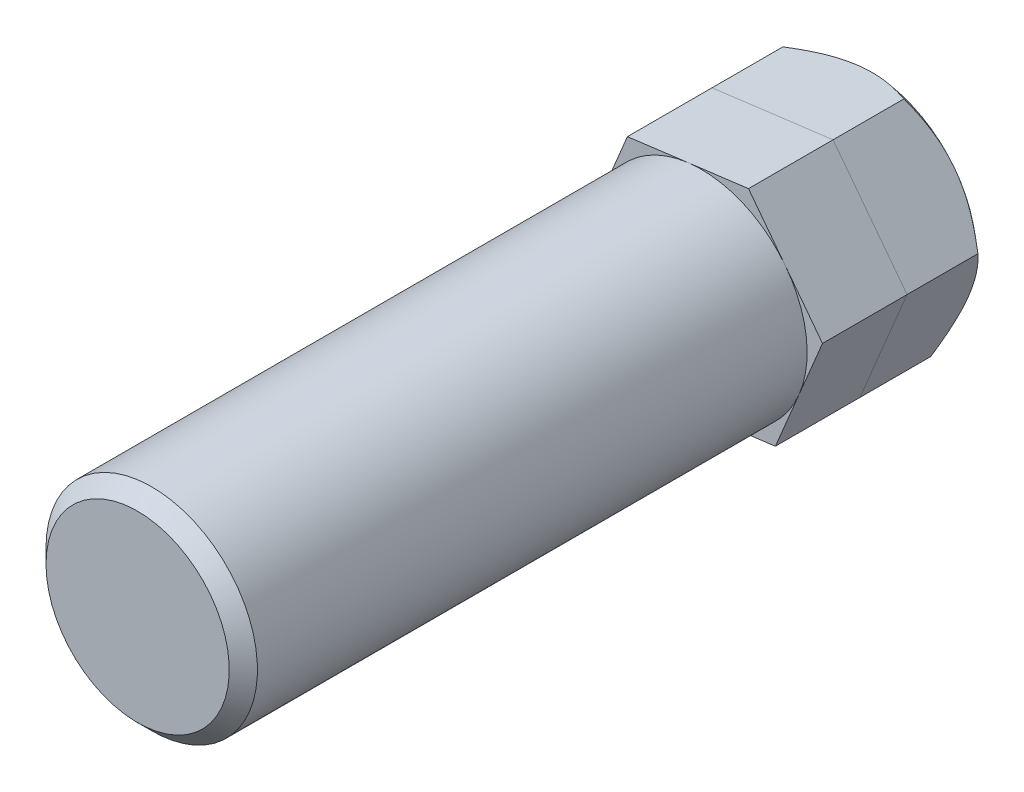
ISO-10303-21;
HEADER;
FILE_DESCRIPTION(('STEP AP214'),'2;1');
FILE_NAME('part.step','',(''),(''),'','','');
FILE_SCHEMA(('AUTOMOTIVE_DESIGN { 1 0 10303 214 1 1 1 1 }'));
ENDSEC;
DATA;
#1=APPLICATION_CONTEXT('core data for automotive mechanical design processes');
#2=APPLICATION_PROTOCOL_DEFINITION('international standard','automotive_design',2000,#1);
#3=PRODUCT_CONTEXT('',#1,'mechanical');
#4=PRODUCT('Part','Part','',(#3));
#5=PRODUCT_RELATED_PRODUCT_CATEGORY('part','',(#4));
#6=PRODUCT_DEFINITION_FORMATION('','',#4);
#7=PRODUCT_DEFINITION_CONTEXT('part definition',#1,'design');
#8=PRODUCT_DEFINITION('design','',#6,#7);
#9=PRODUCT_DEFINITION_SHAPE('','',#8);
#10=(LENGTH_UNIT() NAMED_UNIT(*) SI_UNIT(.MILLI.,.METRE.));
#11=(NAMED_UNIT(*) PLANE_ANGLE_UNIT() SI_UNIT($,.RADIAN.));
#12=(NAMED_UNIT(*) SI_UNIT($,.STERADIAN.) SOLID_ANGLE_UNIT());
#13=UNCERTAINTY_MEASURE_WITH_UNIT(LENGTH_MEASURE(1.E-05),#10,'distance_accuracy_value','');
#14=(GEOMETRIC_REPRESENTATION_CONTEXT(3) GLOBAL_UNCERTAINTY_ASSIGNED_CONTEXT((#13)) GLOBAL_UNIT_ASSIGNED_CONTEXT((#10,
#11,#12)) REPRESENTATION_CONTEXT('',''));
#15=CARTESIAN_POINT('',(0.,0.,0.));
#16=DIRECTION('',(0.,0.,1.));
#17=DIRECTION('',(1.,0.,0.));
#18=AXIS2_PLACEMENT_3D('',#15,#16,#17);
#19=CARTESIAN_POINT('',(-8.58993862808278,-1.10134207482113,-52.));
#20=DIRECTION('',(0.922579877145062,-0.385806130442483,0.));
#21=DIRECTION('',(0.385806130442483,0.922579877145062,0.));
#22=AXIS2_PLACEMENT_3D('',#19,#20,#21);
#23=PLANE('',#22);
#24=CARTESIAN_POINT('',(-8.59002226444641,-1.10154207482113,-51.026340311631));
#25=CARTESIAN_POINT('',(-8.53377014086731,-0.96702612713198,-51.0875085611409));
#26=CARTESIAN_POINT('',(-8.47720055395256,-0.831751027988002,-51.1467175475263));
#27=CARTESIAN_POINT('',(-8.36338103235081,-0.559573911114254,-51.2607068762048));
#28=CARTESIAN_POINT('',(-8.30613088252565,-0.422671378923652,-51.3154857729325));
#29=CARTESIAN_POINT('',(-8.13300505145684,-0.0086748263678155,-51.4726637107743));
#30=CARTESIAN_POINT('',(-8.01608732404049,0.270911043540857,-51.567534799761));
#31=CARTESIAN_POINT('',(-7.78067792578121,0.833846561117379,-51.7315243665977));
#32=CARTESIAN_POINT('',(-7.66221048288123,1.11713827239994,-51.8008707818279));
#33=CARTESIAN_POINT('',(-7.48309333825638,1.54546187911155,-51.8829320941813));
#34=CARTESIAN_POINT('',(-7.42317735813299,1.68873922288486,-51.9066207440832));
#35=CARTESIAN_POINT('',(-7.30296791062,1.97619659737243,-51.9462469670778));
#36=CARTESIAN_POINT('',(-7.24267449610398,2.12037650164989,-51.9621856022774));
#37=CARTESIAN_POINT('',(-7.12080352391906,2.41180708730948,-51.986170790856));
#38=CARTESIAN_POINT('',(-7.05922180337203,2.5590677234002,-51.9940759611731));
#39=CARTESIAN_POINT('',(-6.93598509514346,2.85376419959895,-52.0013219835031));
#40=CARTESIAN_POINT('',(-6.87433010999763,3.00120003364332,-52.0006631237565));
#41=CARTESIAN_POINT('',(-6.75109890372541,3.29588335298993,-51.9907928475705));
#42=CARTESIAN_POINT('',(-6.68952272040543,3.44313074788555,-51.9815782514472));
#43=CARTESIAN_POINT('',(-6.56663763165669,3.7369863948934,-51.9548145508762));
#44=CARTESIAN_POINT('',(-6.505328764839,3.88359455467484,-51.9372642802097));
#45=CARTESIAN_POINT('',(-6.32206142727575,4.32184253580433,-51.8726612748921));
#46=CARTESIAN_POINT('',(-6.20071164984,4.61202678619417,-51.8136517865799));
#47=CARTESIAN_POINT('',(-5.96049284294287,5.18646306355687,-51.6682312829833));
#48=CARTESIAN_POINT('',(-5.84162489269428,5.4707125098035,-51.5818086012074));
#49=CARTESIAN_POINT('',(-5.68382153494708,5.84806836528592,-51.450782664686));
#50=CARTESIAN_POINT('',(-5.64363535745074,5.94416574625544,-51.4159666076294));
#51=CARTESIAN_POINT('',(-5.56360392040255,6.13554526963154,-51.3439167923615));
#52=CARTESIAN_POINT('',(-5.52375852232242,6.23082774330141,-51.3066840751193));
#53=CARTESIAN_POINT('',(-5.44453222130809,6.42028194137917,-51.230115548008));
#54=CARTESIAN_POINT('',(-5.40515017126189,6.51445640888094,-51.190787677332));
#55=CARTESIAN_POINT('',(-5.32668621137793,6.7020876172991,-51.1100670353247));
#56=CARTESIAN_POINT('',(-5.287604410883,6.79554409674349,-51.068673549395));
#57=CARTESIAN_POINT('',(-5.24867589272951,6.88863403145837,-51.026340311631));
#58=B_SPLINE_CURVE_WITH_KNOTS('',3,(#24,#25,#26,#27,#28,#29,#30,#31,#32,#33,#34,#35,#36,#37,#38,
#39,#40,#41,#42,#43,#44,#45,#46,#47,#48,#49,#50,#51,#52,#53,#54,#55,#56,#57),.UNSPECIFIED.,.F.,
.F.,(4,2,2,2,2,2,2,2,2,2,2,2,2,2,2,2,4),(0.,0.474324198766248,0.948802553120619,1.9005727913575,
2.84362466845069,3.31475083538571,3.7858124182595,4.265027816882,4.74422708654271,
5.22360451882651,5.70304903911429,6.66154650881439,7.62045244386293,7.94991498877716,
8.27923654859068,8.60738846199818,8.93565469721078),.UNSPECIFIED.);
#59=CARTESIAN_POINT('',(-8.58993862808278,-1.10134207482113,-51.0264312647728));
#60=VERTEX_POINT('',#59);
#61=CARTESIAN_POINT('',(-6.91934907858796,2.89354597831862,-52.));
#62=VERTEX_POINT('',#61);
#63=EDGE_CURVE('E206',#60,#62,#58,.T.);
#64=ORIENTED_EDGE('',*,*,#63,.F.);
#65=DIRECTION('',(0.,0.,1.));
#66=VECTOR('',#65,1.);
#67=CARTESIAN_POINT('',(-8.58993862808278,-1.10134207482113,-52.));
#68=LINE('',#67,#66);
#69=CARTESIAN_POINT('',(-8.58993862808278,-1.10134207482113,-46.));
#70=VERTEX_POINT('',#69);
#71=EDGE_CURVE('E209',#60,#70,#68,.T.);
#72=ORIENTED_EDGE('',*,*,#71,.T.);
#73=DIRECTION('',(0.385806130442483,0.922579877145062,0.));
#74=VECTOR('',#73,1.);
#75=CARTESIAN_POINT('',(-8.58993862808278,-1.10134207482113,-46.));
#76=LINE('',#75,#74);
#77=CARTESIAN_POINT('',(-5.24875952909315,6.88843403145837,-46.));
#78=VERTEX_POINT('',#77);
#79=EDGE_CURVE('E211',#70,#78,#76,.T.);
#80=ORIENTED_EDGE('',*,*,#79,.T.);
#81=DIRECTION('',(0.,0.,1.));
#82=VECTOR('',#81,1.);
#83=CARTESIAN_POINT('',(-5.24875952909315,6.88843403145837,-52.));
#84=LINE('',#83,#82);
#85=CARTESIAN_POINT('',(-5.24875952909315,6.88843403145837,-51.0264312647728));
#86=VERTEX_POINT('',#85);
#87=EDGE_CURVE('E230',#86,#78,#84,.T.);
#88=ORIENTED_EDGE('',*,*,#87,.F.);
#89=EDGE_CURVE('E120',#62,#86,#58,.T.);
#90=ORIENTED_EDGE('',*,*,#89,.F.);
#91=EDGE_LOOP('',(#64,#72,#80,#88,#90));
#92=FACE_BOUND('',#91,.T.);
#93=ADVANCED_FACE('F44',(#92),#23,.F.);
#94=CARTESIAN_POINT('',(-5.24875952909315,6.88843403145837,-52.));
#95=DIRECTION('',(0.127172028673568,-0.991880675849191,0.));
#96=DIRECTION('',(0.991880675849192,0.127172028673568,0.));
#97=AXIS2_PLACEMENT_3D('',#94,#95,#96);
#98=PLANE('',#97);
#99=CARTESIAN_POINT('',(-5.24895952909315,6.888408388852,-51.0263466664634));
#100=CARTESIAN_POINT('',(-5.10433939068617,6.9069505752622,-51.0875146915551));
#101=CARTESIAN_POINT('',(-4.95890307720289,6.92559740595344,-51.1467234508275));
#102=CARTESIAN_POINT('',(-4.66628132682386,6.96311532775169,-51.2607123205004));
#103=CARTESIAN_POINT('',(-4.51909533682376,6.9819864897739,-51.3154909853335));
#104=CARTESIAN_POINT('',(-4.07400136841499,7.03905333691703,-51.4726682185672));
#105=CARTESIAN_POINT('',(-3.77341436875176,7.07759250747537,-51.5675388290223));
#106=CARTESIAN_POINT('',(-3.16819389465971,7.15518965939001,-51.7315274439841));
#107=CARTESIAN_POINT('',(-2.86362270819353,7.19423965461777,-51.8008733855071));
#108=CARTESIAN_POINT('',(-2.40312557309435,7.25328138846221,-51.8829340091149));
#109=CARTESIAN_POINT('',(-2.24908595569838,7.27303127483193,-51.9066224331764));
#110=CARTESIAN_POINT('',(-1.94003623852985,7.31265547605923,-51.9462482165562));
#111=CARTESIAN_POINT('',(-1.78502627468961,7.3325297734885,-51.9621866379763));
#112=CARTESIAN_POINT('',(-1.47170494168344,7.3727016515332,-51.9861714108003));
#113=CARTESIAN_POINT('',(-1.31338287033203,7.39300060430826,-51.9940763806354));
#114=CARTESIAN_POINT('',(-0.996550373253947,7.4336226593439,-52.0013220272447));
#115=CARTESIAN_POINT('',(-0.838039954046063,7.45394576076868,-52.0006629922586));
#116=CARTESIAN_POINT('',(-0.521221620170635,7.49456599989716,-51.9907923949009));
#117=CARTESIAN_POINT('',(-0.362913802704524,7.51486312513838,-51.9815776528303));
#118=CARTESIAN_POINT('',(-0.0469853258814115,7.55536927299628,-51.9548136921873));
#119=CARTESIAN_POINT('',(0.110635234208787,7.57557828288568,-51.9372633074035));
#120=CARTESIAN_POINT('',(0.581801986577876,7.63598800070886,-51.872660010108));
#121=CARTESIAN_POINT('',(0.89378326704635,7.67598806655487,-51.8136503939843));
#122=CARTESIAN_POINT('',(1.51136800830125,7.75517047864893,-51.6682297566946));
#123=CARTESIAN_POINT('',(1.81696869455454,7.79435246916567,-51.5818070692668));
#124=CARTESIAN_POINT('',(2.22266791564314,7.84636839631634,-51.4507816800668));
#125=CARTESIAN_POINT('',(2.32598209586111,7.85961462059409,-51.4159661716723));
#126=CARTESIAN_POINT('',(2.53173400824279,7.8859946970873,-51.3439175319521));
#127=CARTESIAN_POINT('',(2.63417209653785,7.89912859496345,-51.3066854415513));
#128=CARTESIAN_POINT('',(2.83785412508957,7.92524328537527,-51.2301182336343));
#129=CARTESIAN_POINT('',(2.93910101436374,7.93822445601342,-51.1907910549777));
#130=CARTESIAN_POINT('',(3.14082317816846,7.96408786622404,-51.1100718579276));
#131=CARTESIAN_POINT('',(3.24129817159562,7.97697006975538,-51.0686791249582));
#132=CARTESIAN_POINT('',(3.34137909898963,7.98980174888587,-51.0263466664634));
#133=B_SPLINE_CURVE_WITH_KNOTS('',3,(#99,#100,#101,#102,#103,#104,#105,#106,#107,#108,#109,#110,
#111,#112,#113,#114,#115,#116,#117,#118,#119,#120,#121,#122,#123,#124,#125,#126,#127,#128,#129,
#130,#131,#132),.UNSPECIFIED.,.F.,.F.,(4,2,2,2,2,2,2,2,2,2,2,2,2,2,2,2,4),(0.,0.474323516251049,
0.94880118791647,1.90057004326525,2.84362056426704,3.3147460547915,3.78580696154729,
4.26502160403018,4.74422011757064,5.22359679490435,5.70304055996117,6.66153650343959,
7.62044090538751,7.94989810562754,8.27921432448177,8.60736092880068,8.93562185285166),.UNSPECIFIED.);
#134=CARTESIAN_POINT('',(-0.953790215051762,7.43910506886893,-52.));
#135=VERTEX_POINT('',#134);
#136=EDGE_CURVE('E116',#86,#135,#133,.T.);
#137=ORIENTED_EDGE('',*,*,#136,.F.);
#138=ORIENTED_EDGE('',*,*,#87,.T.);
#139=DIRECTION('',(0.991880675849192,0.127172028673568,0.));
#140=VECTOR('',#139,1.);
#141=CARTESIAN_POINT('',(-5.24875952909315,6.88843403145837,-46.));
#142=LINE('',#141,#140);
#143=CARTESIAN_POINT('',(3.34117909898963,7.9897761062795,-46.));
#144=VERTEX_POINT('',#143);
#145=EDGE_CURVE('E255',#78,#144,#142,.T.);
#146=ORIENTED_EDGE('',*,*,#145,.T.);
#147=DIRECTION('',(0.,0.,1.));
#148=VECTOR('',#147,1.);
#149=CARTESIAN_POINT('',(3.34117909898963,7.9897761062795,-52.));
#150=LINE('',#149,#148);
#151=CARTESIAN_POINT('',(3.34117909898963,7.9897761062795,-51.0264312647728));
#152=VERTEX_POINT('',#151);
#153=EDGE_CURVE('E139',#152,#144,#150,.T.);
#154=ORIENTED_EDGE('',*,*,#153,.F.);
#155=EDGE_CURVE('E124',#135,#152,#133,.T.);
#156=ORIENTED_EDGE('',*,*,#155,.F.);
#157=EDGE_LOOP('',(#137,#138,#146,#154,#156));
#158=FACE_BOUND('',#157,.T.);
#159=ADVANCED_FACE('F137',(#158),#98,.F.);
#160=CARTESIAN_POINT('',(3.34117909898963,7.9897761062795,-52.));
#161=DIRECTION('',(-0.795407848471494,-0.606074545406709,0.));
#162=DIRECTION('',(0.606074545406709,-0.795407848471494,0.));
#163=AXIS2_PLACEMENT_3D('',#160,#161,#162);
#164=PLANE('',#163);
#165=CARTESIAN_POINT('',(3.34102670558627,7.9899761062795,-51.026325769472));
#166=CARTESIAN_POINT('',(3.42939508326072,7.87400208676053,-51.0874945325293));
#167=CARTESIAN_POINT('',(3.51826217516212,7.75737355829828,-51.1467040386289));
#168=CARTESIAN_POINT('',(3.69706514251653,7.52271383757325,-51.2606944176733));
#169=CARTESIAN_POINT('',(3.78700135593785,7.4046822017633,-51.3154738450574));
#170=CARTESIAN_POINT('',(4.05897064136969,7.04775167924729,-51.4726533952903));
#171=CARTESIAN_POINT('',(4.24264070486325,6.80670441676245,-51.5675255793258));
#172=CARTESIAN_POINT('',(4.61245342099085,6.32136488369386,-51.7315173243893));
#173=CARTESIAN_POINT('',(4.79855801266919,6.07712256403299,-51.80086482363));
#174=CARTESIAN_POINT('',(5.07993935016624,5.70783973248234,-51.8829277120794));
#175=CARTESIAN_POINT('',(5.17406344828939,5.58431194708887,-51.9066168787849));
#176=CARTESIAN_POINT('',(5.36290466621658,5.33647809893837,-51.9462441077764));
#177=CARTESIAN_POINT('',(5.45762170295721,5.21217214519319,-51.9621832321804));
#178=CARTESIAN_POINT('',(5.64907312790551,4.96091268023292,-51.9861693721559));
#179=CARTESIAN_POINT('',(5.74581405610191,4.83395058598393,-51.994075001249));
#180=CARTESIAN_POINT('',(5.9394110244901,4.57987532533606,-52.0013218833652));
#181=CARTESIAN_POINT('',(6.03626706069797,4.45276216416563,-52.0006634246305));
#182=CARTESIAN_POINT('',(6.22985541114389,4.19869821364284,-51.9907938834036));
#183=CARTESIAN_POINT('',(6.32658766599604,4.0717475022281,-51.9815796212615));
#184=CARTESIAN_POINT('',(6.51963230813691,3.81839711055115,-51.9548165158318));
#185=CARTESIAN_POINT('',(6.61594463477099,3.69199750989165,-51.9372665063081));
#186=CARTESIAN_POINT('',(6.90384597113451,3.31415787900053,-51.8726641691456));
#187=CARTESIAN_POINT('',(7.09447877130594,3.0639727712747,-51.8136549733149));
#188=CARTESIAN_POINT('',(7.47184727479508,2.56871707753858,-51.6682347756615));
#189=CARTESIAN_POINT('',(7.65858128267795,2.32364871660469,-51.5818121068217));
#190=CARTESIAN_POINT('',(7.90648245793922,1.99830500774492,-51.4507849178418));
#191=CARTESIAN_POINT('',(7.96961449379408,1.91545098064625,-51.415967605254));
#192=CARTESIAN_POINT('',(8.09534296770527,1.75044584112469,-51.3439150999158));
#193=CARTESIAN_POINT('',(8.1579396234011,1.66829444307328,-51.3066809482357));
#194=CARTESIAN_POINT('',(8.28240319409231,1.5049493533861,-51.2301094023319));
#195=CARTESIAN_POINT('',(8.3442719112989,1.42375329654138,-51.190779948064));
#196=CARTESIAN_POINT('',(8.46753781165942,1.26198002073111,-51.1100559994679));
#197=CARTESIAN_POINT('',(8.52893482303021,1.18140302721252,-51.0686607904896));
#198=CARTESIAN_POINT('',(8.59009102148613,1.10114207482113,-51.026325769472));
#199=B_SPLINE_CURVE_WITH_KNOTS('',3,(#165,#166,#167,#168,#169,#170,#171,#172,#173,#174,#175,
#176,#177,#178,#179,#180,#181,#182,#183,#184,#185,#186,#187,#188,#189,#190,#191,#192,#193,#194,
#195,#196,#197,#198),.UNSPECIFIED.,.F.,.F.,(4,2,2,2,2,2,2,2,2,2,2,2,2,2,2,2,4),(0.,
0.474325760601712,0.948805677189121,1.90057907996115,2.84363406027124,3.31476177507306,
3.78582490514418,4.26504203408251,4.74424303401474,5.2236221938922,5.70306844241636,
6.66156940465228,7.62047884797818,7.94995362339912,8.27928740521826,8.6074514676993,
8.9357298567291),.UNSPECIFIED.);
#200=CARTESIAN_POINT('',(5.9655588635362,4.54555909055032,-52.));
#201=VERTEX_POINT('',#200);
#202=EDGE_CURVE('E129',#152,#201,#199,.T.);
#203=ORIENTED_EDGE('',*,*,#202,.F.);
#204=ORIENTED_EDGE('',*,*,#153,.T.);
#205=DIRECTION('',(0.606074545406709,-0.795407848471494,0.));
#206=VECTOR('',#205,1.);
#207=CARTESIAN_POINT('',(3.34117909898963,7.9897761062795,-46.));
#208=LINE('',#207,#206);
#209=CARTESIAN_POINT('',(8.58993862808278,1.10134207482113,-46.));
#210=VERTEX_POINT('',#209);
#211=EDGE_CURVE('E256',#144,#210,#208,.T.);
#212=ORIENTED_EDGE('',*,*,#211,.T.);
#213=DIRECTION('',(0.,0.,1.));
#214=VECTOR('',#213,1.);
#215=CARTESIAN_POINT('',(8.58993862808278,1.10134207482113,-52.));
#216=LINE('',#215,#214);
#217=CARTESIAN_POINT('',(8.58993862808278,1.10134207482113,-51.0264312647728));
#218=VERTEX_POINT('',#217);
#219=EDGE_CURVE('E228',#218,#210,#216,.T.);
#220=ORIENTED_EDGE('',*,*,#219,.F.);
#221=EDGE_CURVE('E140',#201,#218,#199,.T.);
#222=ORIENTED_EDGE('',*,*,#221,.F.);
#223=EDGE_LOOP('',(#203,#204,#212,#220,#222));
#224=FACE_BOUND('',#223,.T.);
#225=ADVANCED_FACE('F192',(#224),#164,.F.);
#226=CARTESIAN_POINT('',(8.58993862808278,1.10134207482113,-52.));
#227=DIRECTION('',(-0.922579877145062,0.385806130442483,0.));
#228=DIRECTION('',(-0.385806130442483,-0.922579877145062,0.));
#229=AXIS2_PLACEMENT_3D('',#226,#227,#228);
#230=PLANE('',#229);
#231=CARTESIAN_POINT('',(8.59002226444642,1.10154207482113,-51.026340311631));
#232=CARTESIAN_POINT('',(8.53377014086731,0.967026127131978,-51.0875085611409));
#233=CARTESIAN_POINT('',(8.47720055395256,0.831751027988,-51.1467175475263));
#234=CARTESIAN_POINT('',(8.36338103235081,0.559573911114254,-51.2607068762048));
#235=CARTESIAN_POINT('',(8.30613088252565,0.422671378923653,-51.3154857729325));
#236=CARTESIAN_POINT('',(8.13300505145684,0.00867482636781865,-51.4726637107743));
#237=CARTESIAN_POINT('',(8.01608732404049,-0.270911043540855,-51.567534799761));
#238=CARTESIAN_POINT('',(7.78067792578122,-0.833846561117377,-51.7315243665977));
#239=CARTESIAN_POINT('',(7.66221048288123,-1.11713827239994,-51.8008707818279));
#240=CARTESIAN_POINT('',(7.48309333825638,-1.54546187911154,-51.8829320941813));
#241=CARTESIAN_POINT('',(7.423177358133,-1.68873922288485,-51.9066207440832));
#242=CARTESIAN_POINT('',(7.30296791062001,-1.97619659737243,-51.9462469670778));
#243=CARTESIAN_POINT('',(7.24267449610398,-2.12037650164989,-51.9621856022774));
#244=CARTESIAN_POINT('',(7.12080352391906,-2.41180708730948,-51.986170790856));
#245=CARTESIAN_POINT('',(7.05922180337203,-2.5590677234002,-51.9940759611731));
#246=CARTESIAN_POINT('',(6.93598509514346,-2.85376419959895,-52.0013219835031));
#247=CARTESIAN_POINT('',(6.87433010999763,-3.00120003364332,-52.0006631237565));
#248=CARTESIAN_POINT('',(6.75109890372542,-3.29588335298993,-51.9907928475705));
#249=CARTESIAN_POINT('',(6.68952272040543,-3.44313074788555,-51.9815782514472));
#250=CARTESIAN_POINT('',(6.56663763165669,-3.7369863948934,-51.9548145508762));
#251=CARTESIAN_POINT('',(6.505328764839,-3.88359455467484,-51.9372642802097));
#252=CARTESIAN_POINT('',(6.32206142727576,-4.32184253580432,-51.8726612748921));
#253=CARTESIAN_POINT('',(6.20071164984,-4.61202678619417,-51.8136517865799));
#254=CARTESIAN_POINT('',(5.96049284294287,-5.18646306355687,-51.6682312829833));
#255=CARTESIAN_POINT('',(5.84162489269428,-5.4707125098035,-51.5818086012074));
#256=CARTESIAN_POINT('',(5.68382153494709,-5.84806836528592,-51.450782664686));
#257=CARTESIAN_POINT('',(5.64363535745074,-5.94416574625544,-51.4159666076294));
#258=CARTESIAN_POINT('',(5.56360392040255,-6.13554526963154,-51.3439167923615));
#259=CARTESIAN_POINT('',(5.52375852232243,-6.23082774330141,-51.3066840751193));
#260=CARTESIAN_POINT('',(5.44453222130809,-6.42028194137916,-51.230115548008));
#261=CARTESIAN_POINT('',(5.4051501712619,-6.51445640888094,-51.190787677332));
#262=CARTESIAN_POINT('',(5.32668621137794,-6.7020876172991,-51.1100670353247));
#263=CARTESIAN_POINT('',(5.28760441088301,-6.79554409674349,-51.068673549395));
#264=CARTESIAN_POINT('',(5.24867589272952,-6.88863403145837,-51.026340311631));
#265=B_SPLINE_CURVE_WITH_KNOTS('',3,(#231,#232,#233,#234,#235,#236,#237,#238,#239,#240,#241,
#242,#243,#244,#245,#246,#247,#248,#249,#250,#251,#252,#253,#254,#255,#256,#257,#258,#259,#260,
#261,#262,#263,#264),.UNSPECIFIED.,.F.,.F.,(4,2,2,2,2,2,2,2,2,2,2,2,2,2,2,2,4),(0.,
0.47432419876625,0.948802553120616,1.9005727913575,2.84362466845069,3.3147508353857,
3.78581241825949,4.265027816882,4.7442270865427,5.22360451882651,5.70304903911429,
6.66154650881438,7.62045244386293,7.94991498877716,8.27923654859068,8.60738846199817,
8.93565469721078),.UNSPECIFIED.);
#266=CARTESIAN_POINT('',(6.91934907858796,-2.89354597831862,-52.));
#267=VERTEX_POINT('',#266);
#268=EDGE_CURVE('E186',#218,#267,#265,.T.);
#269=ORIENTED_EDGE('',*,*,#268,.F.);
#270=ORIENTED_EDGE('',*,*,#219,.T.);
#271=DIRECTION('',(-0.385806130442483,-0.922579877145062,0.));
#272=VECTOR('',#271,1.);
#273=CARTESIAN_POINT('',(8.58993862808278,1.10134207482113,-46.));
#274=LINE('',#273,#272);
#275=CARTESIAN_POINT('',(5.24875952909315,-6.88843403145837,-46.));
#276=VERTEX_POINT('',#275);
#277=EDGE_CURVE('E253',#210,#276,#274,.T.);
#278=ORIENTED_EDGE('',*,*,#277,.T.);
#279=DIRECTION('',(0.,0.,1.));
#280=VECTOR('',#279,1.);
#281=CARTESIAN_POINT('',(5.24875952909315,-6.88843403145837,-52.));
#282=LINE('',#281,#280);
#283=CARTESIAN_POINT('',(5.24875952909315,-6.88843403145837,-51.0264312647728));
#284=VERTEX_POINT('',#283);
#285=EDGE_CURVE('E221',#284,#276,#282,.T.);
#286=ORIENTED_EDGE('',*,*,#285,.F.);
#287=EDGE_CURVE('E181',#267,#284,#265,.T.);
#288=ORIENTED_EDGE('',*,*,#287,.F.);
#289=EDGE_LOOP('',(#269,#270,#278,#286,#288));
#290=FACE_BOUND('',#289,.T.);
#291=ADVANCED_FACE('F188',(#290),#230,.F.);
#292=CARTESIAN_POINT('',(5.24875952909315,-6.88843403145837,-52.));
#293=DIRECTION('',(-0.127172028673568,0.991880675849191,0.));
#294=DIRECTION('',(-0.991880675849192,-0.127172028673568,0.));
#295=AXIS2_PLACEMENT_3D('',#292,#293,#294);
#296=PLANE('',#295);
#297=CARTESIAN_POINT('',(5.24895952909315,-6.888408388852,-51.0263466664634));
#298=CARTESIAN_POINT('',(5.10433939068617,-6.9069505752622,-51.0875146915551));
#299=CARTESIAN_POINT('',(4.95890307720289,-6.92559740595344,-51.1467234508275));
#300=CARTESIAN_POINT('',(4.66628132682386,-6.96311532775169,-51.2607123205004));
#301=CARTESIAN_POINT('',(4.51909533682377,-6.98198648977389,-51.3154909853335));
#302=CARTESIAN_POINT('',(4.07400136841499,-7.03905333691703,-51.4726682185672));
#303=CARTESIAN_POINT('',(3.77341436875176,-7.07759250747537,-51.5675388290223));
#304=CARTESIAN_POINT('',(3.16819389465971,-7.15518965939001,-51.7315274439841));
#305=CARTESIAN_POINT('',(2.86362270819353,-7.19423965461777,-51.8008733855071));
#306=CARTESIAN_POINT('',(2.40312557309435,-7.25328138846221,-51.8829340091149));
#307=CARTESIAN_POINT('',(2.24908595569838,-7.27303127483193,-51.9066224331764));
#308=CARTESIAN_POINT('',(1.94003623852985,-7.31265547605923,-51.9462482165562));
#309=CARTESIAN_POINT('',(1.78502627468961,-7.3325297734885,-51.9621866379763));
#310=CARTESIAN_POINT('',(1.47170494168344,-7.3727016515332,-51.9861714108003));
#311=CARTESIAN_POINT('',(1.31338287033203,-7.39300060430826,-51.9940763806354));
#312=CARTESIAN_POINT('',(0.996550373253944,-7.4336226593439,-52.0013220272447));
#313=CARTESIAN_POINT('',(0.83803995404606,-7.45394576076868,-52.0006629922586));
#314=CARTESIAN_POINT('',(0.521221620170632,-7.49456599989716,-51.9907923949009));
#315=CARTESIAN_POINT('',(0.362913802704521,-7.51486312513838,-51.9815776528303));
#316=CARTESIAN_POINT('',(0.0469853258814074,-7.55536927299628,-51.9548136921873));
#317=CARTESIAN_POINT('',(-0.110635234208791,-7.57557828288568,-51.9372633074035));
#318=CARTESIAN_POINT('',(-0.581801986577881,-7.63598800070886,-51.872660010108));
#319=CARTESIAN_POINT('',(-0.893783267046355,-7.67598806655487,-51.8136503939843));
#320=CARTESIAN_POINT('',(-1.51136800830125,-7.75517047864893,-51.6682297566946));
#321=CARTESIAN_POINT('',(-1.81696869455455,-7.79435246916567,-51.5818070692668));
#322=CARTESIAN_POINT('',(-2.22266791564314,-7.84636839631634,-51.4507816800668));
#323=CARTESIAN_POINT('',(-2.32598209586112,-7.85961462059409,-51.4159661716723));
#324=CARTESIAN_POINT('',(-2.53173400824279,-7.8859946970873,-51.3439175319521));
#325=CARTESIAN_POINT('',(-2.63417209653785,-7.89912859496345,-51.3066854415513));
#326=CARTESIAN_POINT('',(-2.83785412508957,-7.92524328537527,-51.2301182336343));
#327=CARTESIAN_POINT('',(-2.93910101436374,-7.93822445601342,-51.1907910549777));
#328=CARTESIAN_POINT('',(-3.14082317816846,-7.96408786622404,-51.1100718579276));
#329=CARTESIAN_POINT('',(-3.24129817159562,-7.97697006975538,-51.0686791249582));
#330=CARTESIAN_POINT('',(-3.34137909898962,-7.98980174888587,-51.0263466664634));
#331=B_SPLINE_CURVE_WITH_KNOTS('',3,(#297,#298,#299,#300,#301,#302,#303,#304,#305,#306,#307,
#308,#309,#310,#311,#312,#313,#314,#315,#316,#317,#318,#319,#320,#321,#322,#323,#324,#325,#326,
#327,#328,#329,#330),.UNSPECIFIED.,.F.,.F.,(4,2,2,2,2,2,2,2,2,2,2,2,2,2,2,2,4),(0.,
0.474323516251049,0.948801187916471,1.90057004326525,2.84362056426705,3.31474605479151,
3.7858069615473,4.26502160403019,4.74422011757065,5.22359679490435,5.70304055996117,
6.6615365034396,7.62044090538752,7.94989810562755,8.27921432448178,8.60736092880068,
8.93562185285166),.UNSPECIFIED.);
#332=CARTESIAN_POINT('',(0.953790215051763,-7.43910506886893,-52.));
#333=VERTEX_POINT('',#332);
#334=EDGE_CURVE('E187',#284,#333,#331,.T.);
#335=ORIENTED_EDGE('',*,*,#334,.F.);
#336=ORIENTED_EDGE('',*,*,#285,.T.);
#337=DIRECTION('',(-0.991880675849192,-0.127172028673568,0.));
#338=VECTOR('',#337,1.);
#339=CARTESIAN_POINT('',(5.24875952909315,-6.88843403145837,-46.));
#340=LINE('',#339,#338);
#341=CARTESIAN_POINT('',(-3.34117909898963,-7.9897761062795,-46.));
#342=VERTEX_POINT('',#341);
#343=EDGE_CURVE('E223',#276,#342,#340,.T.);
#344=ORIENTED_EDGE('',*,*,#343,.T.);
#345=DIRECTION('',(0.,0.,1.));
#346=VECTOR('',#345,1.);
#347=CARTESIAN_POINT('',(-3.34117909898963,-7.9897761062795,-52.));
#348=LINE('',#347,#346);
#349=CARTESIAN_POINT('',(-3.34117909898962,-7.9897761062795,-51.0264312647728));
#350=VERTEX_POINT('',#349);
#351=EDGE_CURVE('E219',#350,#342,#348,.T.);
#352=ORIENTED_EDGE('',*,*,#351,.F.);
#353=EDGE_CURVE('E175',#333,#350,#331,.T.);
#354=ORIENTED_EDGE('',*,*,#353,.F.);
#355=EDGE_LOOP('',(#335,#336,#344,#352,#354));
#356=FACE_BOUND('',#355,.T.);
#357=ADVANCED_FACE('F191',(#356),#296,.F.);
#358=CARTESIAN_POINT('',(-3.34117909898963,-7.9897761062795,-52.));
#359=DIRECTION('',(0.795407848471494,0.606074545406709,0.));
#360=DIRECTION('',(-0.606074545406709,0.795407848471494,0.));
#361=AXIS2_PLACEMENT_3D('',#358,#359,#360);
#362=PLANE('',#361);
#363=CARTESIAN_POINT('',(-3.34102670558627,-7.9899761062795,-51.026325769472));
#364=CARTESIAN_POINT('',(-3.42939508326072,-7.87400208676053,-51.0874945325293));
#365=CARTESIAN_POINT('',(-3.51826217516212,-7.75737355829828,-51.1467040386289));
#366=CARTESIAN_POINT('',(-3.69706514251653,-7.52271383757325,-51.2606944176733));
#367=CARTESIAN_POINT('',(-3.78700135593785,-7.4046822017633,-51.3154738450574));
#368=CARTESIAN_POINT('',(-4.05897064136969,-7.04775167924729,-51.4726533952903));
#369=CARTESIAN_POINT('',(-4.24264070486325,-6.80670441676245,-51.5675255793258));
#370=CARTESIAN_POINT('',(-4.61245342099084,-6.32136488369385,-51.7315173243893));
#371=CARTESIAN_POINT('',(-4.79855801266919,-6.07712256403299,-51.80086482363));
#372=CARTESIAN_POINT('',(-5.07993935016624,-5.70783973248234,-51.8829277120794));
#373=CARTESIAN_POINT('',(-5.17406344828938,-5.58431194708887,-51.9066168787849));
#374=CARTESIAN_POINT('',(-5.36290466621658,-5.33647809893837,-51.9462441077764));
#375=CARTESIAN_POINT('',(-5.45762170295721,-5.21217214519319,-51.9621832321804));
#376=CARTESIAN_POINT('',(-5.6490731279055,-4.96091268023292,-51.9861693721559));
#377=CARTESIAN_POINT('',(-5.74581405610191,-4.83395058598393,-51.994075001249));
#378=CARTESIAN_POINT('',(-5.9394110244901,-4.57987532533606,-52.0013218833652));
#379=CARTESIAN_POINT('',(-6.03626706069797,-4.45276216416563,-52.0006634246305));
#380=CARTESIAN_POINT('',(-6.22985541114388,-4.19869821364284,-51.9907938834036));
#381=CARTESIAN_POINT('',(-6.32658766599604,-4.0717475022281,-51.9815796212615));
#382=CARTESIAN_POINT('',(-6.5196323081369,-3.81839711055115,-51.9548165158318));
#383=CARTESIAN_POINT('',(-6.61594463477098,-3.69199750989165,-51.9372665063081));
#384=CARTESIAN_POINT('',(-6.9038459711345,-3.31415787900053,-51.8726641691456));
#385=CARTESIAN_POINT('',(-7.09447877130594,-3.0639727712747,-51.8136549733149));
#386=CARTESIAN_POINT('',(-7.47184727479508,-2.56871707753858,-51.6682347756615));
#387=CARTESIAN_POINT('',(-7.65858128267795,-2.32364871660469,-51.5818121068217));
#388=CARTESIAN_POINT('',(-7.90648245793922,-1.99830500774492,-51.4507849178418));
#389=CARTESIAN_POINT('',(-7.96961449379408,-1.91545098064625,-51.415967605254));
#390=CARTESIAN_POINT('',(-8.09534296770527,-1.75044584112469,-51.3439150999158));
#391=CARTESIAN_POINT('',(-8.1579396234011,-1.66829444307328,-51.3066809482357));
#392=CARTESIAN_POINT('',(-8.28240319409231,-1.5049493533861,-51.2301094023319));
#393=CARTESIAN_POINT('',(-8.3442719112989,-1.42375329654137,-51.190779948064));
#394=CARTESIAN_POINT('',(-8.46753781165941,-1.26198002073111,-51.1100559994679));
#395=CARTESIAN_POINT('',(-8.52893482303021,-1.18140302721252,-51.0686607904896));
#396=CARTESIAN_POINT('',(-8.59009102148613,-1.10114207482113,-51.026325769472));
#397=B_SPLINE_CURVE_WITH_KNOTS('',3,(#363,#364,#365,#366,#367,#368,#369,#370,#371,#372,#373,
#374,#375,#376,#377,#378,#379,#380,#381,#382,#383,#384,#385,#386,#387,#388,#389,#390,#391,#392,
#393,#394,#395,#396),.UNSPECIFIED.,.F.,.F.,(4,2,2,2,2,2,2,2,2,2,2,2,2,2,2,2,4),(0.,
0.474325760601712,0.948805677189121,1.90057907996115,2.84363406027124,3.31476177507306,
3.78582490514418,4.26504203408251,4.74424303401474,5.2236221938922,5.70306844241635,
6.66156940465228,7.62047884797817,7.94995362339912,8.27928740521826,8.6074514676993,
8.9357298567291),.UNSPECIFIED.);
#398=CARTESIAN_POINT('',(-5.9655588635362,-4.54555909055032,-52.));
#399=VERTEX_POINT('',#398);
#400=EDGE_CURVE('E247',#350,#399,#397,.T.);
#401=ORIENTED_EDGE('',*,*,#400,.F.);
#402=ORIENTED_EDGE('',*,*,#351,.T.);
#403=DIRECTION('',(-0.606074545406709,0.795407848471494,0.));
#404=VECTOR('',#403,1.);
#405=CARTESIAN_POINT('',(-3.34117909898963,-7.9897761062795,-46.));
#406=LINE('',#405,#404);
#407=EDGE_CURVE('E217',#342,#70,#406,.T.);
#408=ORIENTED_EDGE('',*,*,#407,.T.);
#409=ORIENTED_EDGE('',*,*,#71,.F.);
#410=EDGE_CURVE('E134',#399,#60,#397,.T.);
#411=ORIENTED_EDGE('',*,*,#410,.F.);
#412=EDGE_LOOP('',(#401,#402,#408,#409,#411));
#413=FACE_BOUND('',#412,.T.);
#414=ADVANCED_FACE('F215',(#413),#362,.F.);
#415=CARTESIAN_POINT('',(0.,0.,-46.));
#416=DIRECTION('',(0.,0.,-1.));
#417=DIRECTION('',(-1.,0.,0.));
#418=AXIS2_PLACEMENT_3D('',#415,#416,#417);
#419=PLANE('',#418);
#420=ORIENTED_EDGE('',*,*,#79,.F.);
#421=ORIENTED_EDGE('',*,*,#407,.F.);
#422=ORIENTED_EDGE('',*,*,#343,.F.);
#423=ORIENTED_EDGE('',*,*,#277,.F.);
#424=ORIENTED_EDGE('',*,*,#211,.F.);
#425=ORIENTED_EDGE('',*,*,#145,.F.);
#426=EDGE_LOOP('',(#420,#421,#422,#423,#424,#425));
#427=FACE_BOUND('',#426,.T.);
#428=ADVANCED_FACE('F162',(#427),#419,.F.);
#429=CARTESIAN_POINT('',(0.,0.,-52.));
#430=DIRECTION('',(0.,0.,1.));
#431=DIRECTION('',(-1.,0.,0.));
#432=AXIS2_PLACEMENT_3D('',#429,#430,#431);
#433=CONICAL_SURFACE('',#432,7.5,0.872664625997167);
#434=ORIENTED_EDGE('',*,*,#63,.T.);
#435=CARTESIAN_POINT('',(0.,0.,-52.));
#436=DIRECTION('',(0.,0.,-1.));
#437=DIRECTION('',(-1.,0.,0.));
#438=AXIS2_PLACEMENT_3D('',#435,#436,#437);
#439=CIRCLE('',#438,7.5);
#440=EDGE_CURVE('E48',#399,#62,#439,.T.);
#441=ORIENTED_EDGE('',*,*,#440,.F.);
#442=ORIENTED_EDGE('',*,*,#410,.T.);
#443=EDGE_LOOP('',(#434,#441,#442));
#444=FACE_BOUND('',#443,.T.);
#445=ADVANCED_FACE('F157',(#444),#433,.T.);
#446=ORIENTED_EDGE('',*,*,#353,.T.);
#447=ORIENTED_EDGE('',*,*,#400,.T.);
#448=EDGE_CURVE('E68',#333,#399,#439,.T.);
#449=ORIENTED_EDGE('',*,*,#448,.F.);
#450=EDGE_LOOP('',(#446,#447,#449));
#451=FACE_BOUND('',#450,.T.);
#452=ADVANCED_FACE('F161',(#451),#433,.T.);
#453=ORIENTED_EDGE('',*,*,#287,.T.);
#454=ORIENTED_EDGE('',*,*,#334,.T.);
#455=EDGE_CURVE('E232',#267,#333,#439,.T.);
#456=ORIENTED_EDGE('',*,*,#455,.F.);
#457=EDGE_LOOP('',(#453,#454,#456));
#458=FACE_BOUND('',#457,.T.);
#459=ADVANCED_FACE('F243',(#458),#433,.T.);
#460=ORIENTED_EDGE('',*,*,#221,.T.);
#461=ORIENTED_EDGE('',*,*,#268,.T.);
#462=EDGE_CURVE('E53',#201,#267,#439,.T.);
#463=ORIENTED_EDGE('',*,*,#462,.F.);
#464=EDGE_LOOP('',(#460,#461,#463));
#465=FACE_BOUND('',#464,.T.);
#466=ADVANCED_FACE('F261',(#465),#433,.T.);
#467=ORIENTED_EDGE('',*,*,#155,.T.);
#468=ORIENTED_EDGE('',*,*,#202,.T.);
#469=EDGE_CURVE('E13',#135,#201,#439,.T.);
#470=ORIENTED_EDGE('',*,*,#469,.F.);
#471=EDGE_LOOP('',(#467,#468,#470));
#472=FACE_BOUND('',#471,.T.);
#473=ADVANCED_FACE('F127',(#472),#433,.T.);
#474=ORIENTED_EDGE('',*,*,#89,.T.);
#475=ORIENTED_EDGE('',*,*,#136,.T.);
#476=CARTESIAN_POINT('',(0.,0.,-52.));
#477=DIRECTION('',(0.,0.,-1.));
#478=DIRECTION('',(-1.,0.,0.));
#479=AXIS2_PLACEMENT_3D('',#476,#477,#478);
#480=CIRCLE('',#479,7.5);
#481=EDGE_CURVE('E60',#62,#135,#480,.T.);
#482=ORIENTED_EDGE('',*,*,#481,.F.);
#483=EDGE_LOOP('',(#474,#475,#482));
#484=FACE_BOUND('',#483,.T.);
#485=ADVANCED_FACE('F118',(#484),#433,.T.);
#486=CARTESIAN_POINT('',(0.,0.,-52.));
#487=DIRECTION('',(0.,0.,-1.));
#488=DIRECTION('',(-1.,0.,0.));
#489=AXIS2_PLACEMENT_3D('',#486,#487,#488);
#490=PLANE('',#489);
#491=ORIENTED_EDGE('',*,*,#440,.T.);
#492=ORIENTED_EDGE('',*,*,#481,.T.);
#493=ORIENTED_EDGE('',*,*,#469,.T.);
#494=ORIENTED_EDGE('',*,*,#462,.T.);
#495=ORIENTED_EDGE('',*,*,#455,.T.);
#496=ORIENTED_EDGE('',*,*,#448,.T.);
#497=EDGE_LOOP('',(#491,#492,#493,#494,#495,#496));
#498=FACE_BOUND('',#497,.T.);
#499=ADVANCED_FACE('F133',(#498),#490,.T.);
#500=CLOSED_SHELL('',(#93,#159,#225,#291,#357,#414,#428,#445,#452,#459,#466,#473,#485,#499));
#501=MANIFOLD_SOLID_BREP('B2',#500);
#502=CARTESIAN_POINT('',(0.,0.,-40.));
#503=DIRECTION('',(0.,0.,-1.));
#504=DIRECTION('',(-1.,0.,0.));
#505=AXIS2_PLACEMENT_3D('',#502,#503,#504);
#506=CYLINDRICAL_SURFACE('',#505,7.5);
#507=CARTESIAN_POINT('',(0.,0.,-0.999999999999994));
#508=DIRECTION('',(0.,0.,-1.));
#509=DIRECTION('',(-1.,0.,0.));
#510=AXIS2_PLACEMENT_3D('',#507,#508,#509);
#511=CIRCLE('',#510,7.5);
#512=CARTESIAN_POINT('',(-7.5,0.,-0.999999999999994));
#513=VERTEX_POINT('',#512);
#514=EDGE_CURVE('E363',#513,#513,#511,.T.);
#515=ORIENTED_EDGE('',*,*,#514,.T.);
#516=EDGE_LOOP('',(#515));
#517=FACE_BOUND('',#516,.T.);
#518=CARTESIAN_POINT('',(0.,0.,-40.));
#519=DIRECTION('',(0.,0.,-1.));
#520=DIRECTION('',(-1.,0.,0.));
#521=AXIS2_PLACEMENT_3D('',#518,#519,#520);
#522=CIRCLE('',#521,7.49999999999999);
#523=CARTESIAN_POINT('',(-6.91934907858796,2.89354597831862,-40.));
#524=VERTEX_POINT('',#523);
#525=CARTESIAN_POINT('',(-0.953790215051762,7.43910506886893,-40.));
#526=VERTEX_POINT('',#525);
#527=EDGE_CURVE('E453',#524,#526,#522,.T.);
#528=ORIENTED_EDGE('',*,*,#527,.F.);
#529=CARTESIAN_POINT('',(-5.9655588635362,-4.54555909055032,-40.));
#530=VERTEX_POINT('',#529);
#531=EDGE_CURVE('E370',#530,#524,#522,.T.);
#532=ORIENTED_EDGE('',*,*,#531,.F.);
#533=CARTESIAN_POINT('',(0.953790215051764,-7.43910506886893,-40.));
#534=VERTEX_POINT('',#533);
#535=EDGE_CURVE('E374',#534,#530,#522,.T.);
#536=ORIENTED_EDGE('',*,*,#535,.F.);
#537=CARTESIAN_POINT('',(6.91934907858796,-2.89354597831862,-40.));
#538=VERTEX_POINT('',#537);
#539=EDGE_CURVE('E552',#538,#534,#522,.T.);
#540=ORIENTED_EDGE('',*,*,#539,.F.);
#541=CARTESIAN_POINT('',(5.9655588635362,4.54555909055032,-40.));
#542=VERTEX_POINT('',#541);
#543=EDGE_CURVE('E569',#542,#538,#522,.T.);
#544=ORIENTED_EDGE('',*,*,#543,.F.);
#545=EDGE_CURVE('E458',#526,#542,#522,.T.);
#546=ORIENTED_EDGE('',*,*,#545,.F.);
#547=EDGE_LOOP('',(#528,#532,#536,#540,#544,#546));
#548=FACE_BOUND('',#547,.T.);
#549=ADVANCED_FACE('F355',(#517,#548),#506,.T.);
#550=CARTESIAN_POINT('',(7.5,0.,0.));
#551=DIRECTION('',(0.,0.,-1.));
#552=DIRECTION('',(-1.,0.,0.));
#553=AXIS2_PLACEMENT_3D('',#550,#551,#552);
#554=PLANE('',#553);
#555=CARTESIAN_POINT('',(0.,0.,0.));
#556=DIRECTION('',(0.,0.,-1.));
#557=DIRECTION('',(-1.,0.,0.));
#558=AXIS2_PLACEMENT_3D('',#555,#556,#557);
#559=CIRCLE('',#558,6.5);
#560=CARTESIAN_POINT('',(-6.5,0.,0.));
#561=VERTEX_POINT('',#560);
#562=EDGE_CURVE('E42',#561,#561,#559,.F.);
#563=ORIENTED_EDGE('',*,*,#562,.T.);
#564=EDGE_LOOP('',(#563));
#565=FACE_BOUND('',#564,.T.);
#566=ADVANCED_FACE('F472',(#565),#554,.F.);
#567=CARTESIAN_POINT('',(0.,0.,-40.));
#568=DIRECTION('',(0.,0.,-1.));
#569=DIRECTION('',(-1.,0.,0.));
#570=AXIS2_PLACEMENT_3D('',#567,#568,#569);
#571=PLANE('',#570);
#572=DIRECTION('',(0.385806130442483,0.922579877145062,0.));
#573=VECTOR('',#572,1.);
#574=CARTESIAN_POINT('',(-8.58993862808278,-1.10134207482113,-40.));
#575=LINE('',#574,#573);
#576=CARTESIAN_POINT('',(-5.24875952909315,6.88843403145837,-40.));
#577=VERTEX_POINT('',#576);
#578=EDGE_CURVE('E533',#524,#577,#575,.T.);
#579=ORIENTED_EDGE('',*,*,#578,.F.);
#580=ORIENTED_EDGE('',*,*,#527,.T.);
#581=DIRECTION('',(0.991880675849192,0.127172028673568,0.));
#582=VECTOR('',#581,1.);
#583=CARTESIAN_POINT('',(-5.24875952909315,6.88843403145837,-40.));
#584=LINE('',#583,#582);
#585=EDGE_CURVE('E560',#577,#526,#584,.T.);
#586=ORIENTED_EDGE('',*,*,#585,.F.);
#587=EDGE_LOOP('',(#579,#580,#586));
#588=FACE_BOUND('',#587,.T.);
#589=ADVANCED_FACE('F476',(#588),#571,.F.);
#590=CARTESIAN_POINT('',(3.34117909898963,7.9897761062795,-40.));
#591=VERTEX_POINT('',#590);
#592=EDGE_CURVE('E449',#526,#591,#584,.T.);
#593=ORIENTED_EDGE('',*,*,#592,.F.);
#594=ORIENTED_EDGE('',*,*,#545,.T.);
#595=DIRECTION('',(0.606074545406709,-0.795407848471494,0.));
#596=VECTOR('',#595,1.);
#597=CARTESIAN_POINT('',(3.34117909898963,7.9897761062795,-40.));
#598=LINE('',#597,#596);
#599=EDGE_CURVE('E556',#591,#542,#598,.T.);
#600=ORIENTED_EDGE('',*,*,#599,.F.);
#601=EDGE_LOOP('',(#593,#594,#600));
#602=FACE_BOUND('',#601,.T.);
#603=ADVANCED_FACE('F501',(#602),#571,.F.);
#604=CARTESIAN_POINT('',(8.58993862808278,1.10134207482113,-40.));
#605=VERTEX_POINT('',#604);
#606=EDGE_CURVE('E559',#542,#605,#598,.T.);
#607=ORIENTED_EDGE('',*,*,#606,.F.);
#608=ORIENTED_EDGE('',*,*,#543,.T.);
#609=DIRECTION('',(-0.385806130442483,-0.922579877145062,0.));
#610=VECTOR('',#609,1.);
#611=CARTESIAN_POINT('',(8.58993862808278,1.10134207482113,-40.));
#612=LINE('',#611,#610);
#613=EDGE_CURVE('E554',#605,#538,#612,.T.);
#614=ORIENTED_EDGE('',*,*,#613,.F.);
#615=EDGE_LOOP('',(#607,#608,#614));
#616=FACE_BOUND('',#615,.T.);
#617=ADVANCED_FACE('F506',(#616),#571,.F.);
#618=CARTESIAN_POINT('',(5.24875952909315,-6.88843403145837,-40.));
#619=VERTEX_POINT('',#618);
#620=EDGE_CURVE('E550',#538,#619,#612,.T.);
#621=ORIENTED_EDGE('',*,*,#620,.F.);
#622=ORIENTED_EDGE('',*,*,#539,.T.);
#623=DIRECTION('',(-0.991880675849192,-0.127172028673568,0.));
#624=VECTOR('',#623,1.);
#625=CARTESIAN_POINT('',(5.24875952909315,-6.88843403145837,-40.));
#626=LINE('',#625,#624);
#627=EDGE_CURVE('E525',#619,#534,#626,.T.);
#628=ORIENTED_EDGE('',*,*,#627,.F.);
#629=EDGE_LOOP('',(#621,#622,#628));
#630=FACE_BOUND('',#629,.T.);
#631=ADVANCED_FACE('F515',(#630),#571,.F.);
#632=CARTESIAN_POINT('',(-3.34117909898963,-7.9897761062795,-40.));
#633=VERTEX_POINT('',#632);
#634=EDGE_CURVE('E553',#534,#633,#626,.T.);
#635=ORIENTED_EDGE('',*,*,#634,.F.);
#636=ORIENTED_EDGE('',*,*,#535,.T.);
#637=DIRECTION('',(-0.606074545406709,0.795407848471494,0.));
#638=VECTOR('',#637,1.);
#639=CARTESIAN_POINT('',(-3.34117909898963,-7.9897761062795,-40.));
#640=LINE('',#639,#638);
#641=EDGE_CURVE('E524',#633,#530,#640,.T.);
#642=ORIENTED_EDGE('',*,*,#641,.F.);
#643=EDGE_LOOP('',(#635,#636,#642));
#644=FACE_BOUND('',#643,.T.);
#645=ADVANCED_FACE('F510',(#644),#571,.F.);
#646=CARTESIAN_POINT('',(-8.58993862808278,-1.10134207482113,-40.));
#647=VERTEX_POINT('',#646);
#648=EDGE_CURVE('E519',#530,#647,#640,.T.);
#649=ORIENTED_EDGE('',*,*,#648,.F.);
#650=ORIENTED_EDGE('',*,*,#531,.T.);
#651=EDGE_CURVE('E444',#647,#524,#575,.T.);
#652=ORIENTED_EDGE('',*,*,#651,.F.);
#653=EDGE_LOOP('',(#649,#650,#652));
#654=FACE_BOUND('',#653,.T.);
#655=ADVANCED_FACE('F482',(#654),#571,.F.);
#656=CARTESIAN_POINT('',(-5.24875952909315,6.88843403145837,-46.));
#657=DIRECTION('',(0.127172028673568,-0.991880675849191,0.));
#658=DIRECTION('',(0.991880675849192,0.127172028673568,0.));
#659=AXIS2_PLACEMENT_3D('',#656,#657,#658);
#660=PLANE('',#659);
#661=ORIENTED_EDGE('',*,*,#585,.T.);
#662=ORIENTED_EDGE('',*,*,#592,.T.);
#663=DIRECTION('',(0.,0.,1.));
#664=VECTOR('',#663,1.);
#665=CARTESIAN_POINT('',(3.34117909898963,7.9897761062795,-46.));
#666=LINE('',#665,#664);
#667=CARTESIAN_POINT('',(3.34117909898963,7.9897761062795,-46.));
#668=VERTEX_POINT('',#667);
#669=EDGE_CURVE('E429',#668,#591,#666,.T.);
#670=ORIENTED_EDGE('',*,*,#669,.F.);
#671=DIRECTION('',(0.991880675849192,0.127172028673568,0.));
#672=VECTOR('',#671,1.);
#673=CARTESIAN_POINT('',(-5.24875952909315,6.88843403145837,-46.));
#674=LINE('',#673,#672);
#675=CARTESIAN_POINT('',(-5.24875952909315,6.88843403145837,-46.));
#676=VERTEX_POINT('',#675);
#677=EDGE_CURVE('E435',#676,#668,#674,.T.);
#678=ORIENTED_EDGE('',*,*,#677,.F.);
#679=DIRECTION('',(0.,0.,1.));
#680=VECTOR('',#679,1.);
#681=CARTESIAN_POINT('',(-5.24875952909315,6.88843403145837,-46.));
#682=LINE('',#681,#680);
#683=EDGE_CURVE('E538',#676,#577,#682,.T.);
#684=ORIENTED_EDGE('',*,*,#683,.T.);
#685=EDGE_LOOP('',(#661,#662,#670,#678,#684));
#686=FACE_BOUND('',#685,.T.);
#687=ADVANCED_FACE('F447',(#686),#660,.F.);
#688=CARTESIAN_POINT('',(3.34117909898963,7.9897761062795,-46.));
#689=DIRECTION('',(-0.795407848471494,-0.606074545406709,0.));
#690=DIRECTION('',(0.606074545406709,-0.795407848471494,0.));
#691=AXIS2_PLACEMENT_3D('',#688,#689,#690);
#692=PLANE('',#691);
#693=ORIENTED_EDGE('',*,*,#599,.T.);
#694=ORIENTED_EDGE('',*,*,#606,.T.);
#695=DIRECTION('',(0.,0.,1.));
#696=VECTOR('',#695,1.);
#697=CARTESIAN_POINT('',(8.58993862808278,1.10134207482113,-46.));
#698=LINE('',#697,#696);
#699=CARTESIAN_POINT('',(8.58993862808278,1.10134207482113,-46.));
#700=VERTEX_POINT('',#699);
#701=EDGE_CURVE('E431',#700,#605,#698,.T.);
#702=ORIENTED_EDGE('',*,*,#701,.F.);
#703=DIRECTION('',(0.606074545406709,-0.795407848471494,0.));
#704=VECTOR('',#703,1.);
#705=CARTESIAN_POINT('',(3.34117909898963,7.9897761062795,-46.));
#706=LINE('',#705,#704);
#707=EDGE_CURVE('E424',#668,#700,#706,.T.);
#708=ORIENTED_EDGE('',*,*,#707,.F.);
#709=ORIENTED_EDGE('',*,*,#669,.T.);
#710=EDGE_LOOP('',(#693,#694,#702,#708,#709));
#711=FACE_BOUND('',#710,.T.);
#712=ADVANCED_FACE('F427',(#711),#692,.F.);
#713=CARTESIAN_POINT('',(8.58993862808278,1.10134207482113,-46.));
#714=DIRECTION('',(-0.922579877145062,0.385806130442483,0.));
#715=DIRECTION('',(-0.385806130442483,-0.922579877145062,0.));
#716=AXIS2_PLACEMENT_3D('',#713,#714,#715);
#717=PLANE('',#716);
#718=ORIENTED_EDGE('',*,*,#613,.T.);
#719=ORIENTED_EDGE('',*,*,#620,.T.);
#720=DIRECTION('',(0.,0.,1.));
#721=VECTOR('',#720,1.);
#722=CARTESIAN_POINT('',(5.24875952909315,-6.88843403145837,-46.));
#723=LINE('',#722,#721);
#724=CARTESIAN_POINT('',(5.24875952909315,-6.88843403145837,-46.));
#725=VERTEX_POINT('',#724);
#726=EDGE_CURVE('E454',#725,#619,#723,.T.);
#727=ORIENTED_EDGE('',*,*,#726,.F.);
#728=DIRECTION('',(-0.385806130442483,-0.922579877145062,0.));
#729=VECTOR('',#728,1.);
#730=CARTESIAN_POINT('',(8.58993862808278,1.10134207482113,-46.));
#731=LINE('',#730,#729);
#732=EDGE_CURVE('E434',#700,#725,#731,.T.);
#733=ORIENTED_EDGE('',*,*,#732,.F.);
#734=ORIENTED_EDGE('',*,*,#701,.T.);
#735=EDGE_LOOP('',(#718,#719,#727,#733,#734));
#736=FACE_BOUND('',#735,.T.);
#737=ADVANCED_FACE('F485',(#736),#717,.F.);
#738=CARTESIAN_POINT('',(5.24875952909315,-6.88843403145837,-46.));
#739=DIRECTION('',(-0.127172028673568,0.991880675849191,0.));
#740=DIRECTION('',(-0.991880675849192,-0.127172028673568,0.));
#741=AXIS2_PLACEMENT_3D('',#738,#739,#740);
#742=PLANE('',#741);
#743=ORIENTED_EDGE('',*,*,#627,.T.);
#744=ORIENTED_EDGE('',*,*,#634,.T.);
#745=DIRECTION('',(0.,0.,1.));
#746=VECTOR('',#745,1.);
#747=CARTESIAN_POINT('',(-3.34117909898963,-7.9897761062795,-46.));
#748=LINE('',#747,#746);
#749=CARTESIAN_POINT('',(-3.34117909898963,-7.9897761062795,-46.));
#750=VERTEX_POINT('',#749);
#751=EDGE_CURVE('E531',#750,#633,#748,.T.);
#752=ORIENTED_EDGE('',*,*,#751,.F.);
#753=DIRECTION('',(-0.991880675849192,-0.127172028673568,0.));
#754=VECTOR('',#753,1.);
#755=CARTESIAN_POINT('',(5.24875952909315,-6.88843403145837,-46.));
#756=LINE('',#755,#754);
#757=EDGE_CURVE('E547',#725,#750,#756,.T.);
#758=ORIENTED_EDGE('',*,*,#757,.F.);
#759=ORIENTED_EDGE('',*,*,#726,.T.);
#760=EDGE_LOOP('',(#743,#744,#752,#758,#759));
#761=FACE_BOUND('',#760,.T.);
#762=ADVANCED_FACE('F488',(#761),#742,.F.);
#763=CARTESIAN_POINT('',(-3.34117909898963,-7.9897761062795,-46.));
#764=DIRECTION('',(0.795407848471494,0.606074545406709,0.));
#765=DIRECTION('',(-0.606074545406709,0.795407848471494,0.));
#766=AXIS2_PLACEMENT_3D('',#763,#764,#765);
#767=PLANE('',#766);
#768=ORIENTED_EDGE('',*,*,#641,.T.);
#769=ORIENTED_EDGE('',*,*,#648,.T.);
#770=DIRECTION('',(0.,0.,1.));
#771=VECTOR('',#770,1.);
#772=CARTESIAN_POINT('',(-8.58993862808278,-1.10134207482113,-46.));
#773=LINE('',#772,#771);
#774=CARTESIAN_POINT('',(-8.58993862808278,-1.10134207482113,-46.));
#775=VERTEX_POINT('',#774);
#776=EDGE_CURVE('E540',#775,#647,#773,.T.);
#777=ORIENTED_EDGE('',*,*,#776,.F.);
#778=DIRECTION('',(-0.606074545406709,0.795407848471494,0.));
#779=VECTOR('',#778,1.);
#780=CARTESIAN_POINT('',(-3.34117909898963,-7.9897761062795,-46.));
#781=LINE('',#780,#779);
#782=EDGE_CURVE('E563',#750,#775,#781,.T.);
#783=ORIENTED_EDGE('',*,*,#782,.F.);
#784=ORIENTED_EDGE('',*,*,#751,.T.);
#785=EDGE_LOOP('',(#768,#769,#777,#783,#784));
#786=FACE_BOUND('',#785,.T.);
#787=ADVANCED_FACE('F492',(#786),#767,.F.);
#788=CARTESIAN_POINT('',(-8.58993862808278,-1.10134207482113,-46.));
#789=DIRECTION('',(0.922579877145062,-0.385806130442483,0.));
#790=DIRECTION('',(0.385806130442483,0.922579877145062,0.));
#791=AXIS2_PLACEMENT_3D('',#788,#789,#790);
#792=PLANE('',#791);
#793=ORIENTED_EDGE('',*,*,#651,.T.);
#794=ORIENTED_EDGE('',*,*,#578,.T.);
#795=ORIENTED_EDGE('',*,*,#683,.F.);
#796=DIRECTION('',(0.385806130442483,0.922579877145062,0.));
#797=VECTOR('',#796,1.);
#798=CARTESIAN_POINT('',(-8.58993862808278,-1.10134207482113,-46.));
#799=LINE('',#798,#797);
#800=EDGE_CURVE('E440',#775,#676,#799,.T.);
#801=ORIENTED_EDGE('',*,*,#800,.F.);
#802=ORIENTED_EDGE('',*,*,#776,.T.);
#803=EDGE_LOOP('',(#793,#794,#795,#801,#802));
#804=FACE_BOUND('',#803,.T.);
#805=ADVANCED_FACE('F468',(#804),#792,.F.);
#806=CARTESIAN_POINT('',(0.,0.,-46.));
#807=DIRECTION('',(0.,0.,-1.));
#808=DIRECTION('',(-1.,0.,0.));
#809=AXIS2_PLACEMENT_3D('',#806,#807,#808);
#810=PLANE('',#809);
#811=ORIENTED_EDGE('',*,*,#677,.T.);
#812=ORIENTED_EDGE('',*,*,#707,.T.);
#813=ORIENTED_EDGE('',*,*,#732,.T.);
#814=ORIENTED_EDGE('',*,*,#757,.T.);
#815=ORIENTED_EDGE('',*,*,#782,.T.);
#816=ORIENTED_EDGE('',*,*,#800,.T.);
#817=EDGE_LOOP('',(#811,#812,#813,#814,#815,#816));
#818=FACE_BOUND('',#817,.T.);
#819=ADVANCED_FACE('F438',(#818),#810,.T.);
#820=CARTESIAN_POINT('',(0.,0.,-0.999999999999994));
#821=DIRECTION('',(0.,0.,-1.));
#822=DIRECTION('',(-1.,0.,0.));
#823=AXIS2_PLACEMENT_3D('',#820,#821,#822);
#824=CONICAL_SURFACE('',#823,7.5,0.78539816339745);
#825=ORIENTED_EDGE('',*,*,#562,.F.);
#826=EDGE_LOOP('',(#825));
#827=FACE_BOUND('',#826,.T.);
#828=ORIENTED_EDGE('',*,*,#514,.F.);
#829=EDGE_LOOP('',(#828));
#830=FACE_BOUND('',#829,.T.);
#831=ADVANCED_FACE('F357',(#827,#830),#824,.T.);
#832=CLOSED_SHELL('',(#549,#566,#589,#603,#617,#631,#645,#655,#687,#712,#737,#762,#787,#805,
#819,#831));
#833=MANIFOLD_SOLID_BREP('B7',#832);
#834=ADVANCED_BREP_SHAPE_REPRESENTATION('',(#18,#501,#833),#14);
#835=SHAPE_DEFINITION_REPRESENTATION(#9,#834);
ENDSEC;
END-ISO-10303-21;
